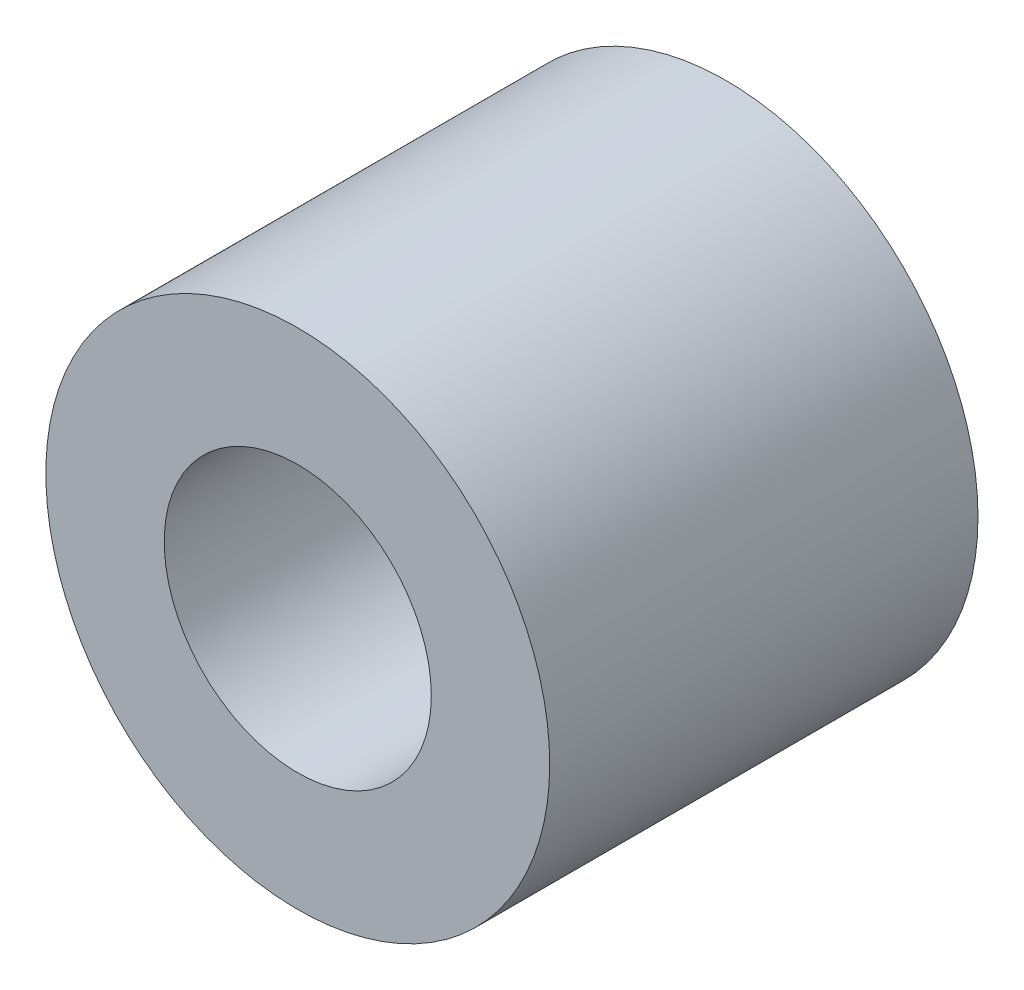
ISO-10303-21;
HEADER;
FILE_DESCRIPTION(('STEP AP214'),'2;1');
FILE_NAME('part.step','',(''),(''),'','','');
FILE_SCHEMA(('AUTOMOTIVE_DESIGN { 1 0 10303 214 1 1 1 1 }'));
ENDSEC;
DATA;
#1=APPLICATION_CONTEXT('core data for automotive mechanical design processes');
#2=APPLICATION_PROTOCOL_DEFINITION('international standard','automotive_design',2000,#1);
#3=PRODUCT_CONTEXT('',#1,'mechanical');
#4=PRODUCT('Part','Part','',(#3));
#5=PRODUCT_RELATED_PRODUCT_CATEGORY('part','',(#4));
#6=PRODUCT_DEFINITION_FORMATION('','',#4);
#7=PRODUCT_DEFINITION_CONTEXT('part definition',#1,'design');
#8=PRODUCT_DEFINITION('design','',#6,#7);
#9=PRODUCT_DEFINITION_SHAPE('','',#8);
#10=(LENGTH_UNIT() NAMED_UNIT(*) SI_UNIT(.MILLI.,.METRE.));
#11=(NAMED_UNIT(*) PLANE_ANGLE_UNIT() SI_UNIT($,.RADIAN.));
#12=(NAMED_UNIT(*) SI_UNIT($,.STERADIAN.) SOLID_ANGLE_UNIT());
#13=UNCERTAINTY_MEASURE_WITH_UNIT(LENGTH_MEASURE(1.E-05),#10,'distance_accuracy_value','');
#14=(GEOMETRIC_REPRESENTATION_CONTEXT(3) GLOBAL_UNCERTAINTY_ASSIGNED_CONTEXT((#13)) GLOBAL_UNIT_ASSIGNED_CONTEXT((#10,
#11,#12)) REPRESENTATION_CONTEXT('',''));
#15=CARTESIAN_POINT('',(0.,0.,0.));
#16=DIRECTION('',(0.,0.,1.));
#17=DIRECTION('',(1.,0.,0.));
#18=AXIS2_PLACEMENT_3D('',#15,#16,#17);
#19=CARTESIAN_POINT('',(0.,0.,8.5));
#20=DIRECTION('',(0.,0.,1.));
#21=DIRECTION('',(1.,0.,0.));
#22=AXIS2_PLACEMENT_3D('',#19,#20,#21);
#23=PLANE('',#22);
#24=CARTESIAN_POINT('',(0.,0.,8.5));
#25=DIRECTION('',(0.,0.,1.));
#26=DIRECTION('',(1.,0.,0.));
#27=AXIS2_PLACEMENT_3D('',#24,#25,#26);
#28=CIRCLE('',#27,5.);
#29=CARTESIAN_POINT('',(5.,0.,8.5));
#30=VERTEX_POINT('',#29);
#31=EDGE_CURVE('E10',#30,#30,#28,.T.);
#32=ORIENTED_EDGE('',*,*,#31,.T.);
#33=EDGE_LOOP('',(#32));
#34=FACE_BOUND('',#33,.T.);
#35=CARTESIAN_POINT('',(0.,0.,8.5));
#36=DIRECTION('',(0.,0.,1.));
#37=DIRECTION('',(1.,0.,0.));
#38=AXIS2_PLACEMENT_3D('',#35,#36,#37);
#39=CIRCLE('',#38,2.65);
#40=CARTESIAN_POINT('',(2.65,0.,8.5));
#41=VERTEX_POINT('',#40);
#42=EDGE_CURVE('E41',#41,#41,#39,.T.);
#43=ORIENTED_EDGE('',*,*,#42,.F.);
#44=EDGE_LOOP('',(#43));
#45=FACE_BOUND('',#44,.T.);
#46=ADVANCED_FACE('F30',(#34,#45),#23,.T.);
#47=CARTESIAN_POINT('',(0.,0.,0.));
#48=DIRECTION('',(0.,0.,1.));
#49=DIRECTION('',(1.,0.,0.));
#50=AXIS2_PLACEMENT_3D('',#47,#48,#49);
#51=PLANE('',#50);
#52=CARTESIAN_POINT('',(0.,0.,0.));
#53=DIRECTION('',(0.,0.,1.));
#54=DIRECTION('',(1.,0.,0.));
#55=AXIS2_PLACEMENT_3D('',#52,#53,#54);
#56=CIRCLE('',#55,5.);
#57=CARTESIAN_POINT('',(5.,0.,0.));
#58=VERTEX_POINT('',#57);
#59=EDGE_CURVE('E34',#58,#58,#56,.T.);
#60=ORIENTED_EDGE('',*,*,#59,.F.);
#61=EDGE_LOOP('',(#60));
#62=FACE_BOUND('',#61,.T.);
#63=CARTESIAN_POINT('',(0.,0.,0.));
#64=DIRECTION('',(0.,0.,1.));
#65=DIRECTION('',(1.,0.,0.));
#66=AXIS2_PLACEMENT_3D('',#63,#64,#65);
#67=CIRCLE('',#66,2.65);
#68=CARTESIAN_POINT('',(2.65,0.,0.));
#69=VERTEX_POINT('',#68);
#70=EDGE_CURVE('E43',#69,#69,#67,.T.);
#71=ORIENTED_EDGE('',*,*,#70,.T.);
#72=EDGE_LOOP('',(#71));
#73=FACE_BOUND('',#72,.T.);
#74=ADVANCED_FACE('F53',(#62,#73),#51,.F.);
#75=CARTESIAN_POINT('',(0.,0.,8.5));
#76=DIRECTION('',(0.,0.,-1.));
#77=DIRECTION('',(-1.,0.,0.));
#78=AXIS2_PLACEMENT_3D('',#75,#76,#77);
#79=CYLINDRICAL_SURFACE('',#78,5.);
#80=ORIENTED_EDGE('',*,*,#31,.F.);
#81=EDGE_LOOP('',(#80));
#82=FACE_BOUND('',#81,.T.);
#83=ORIENTED_EDGE('',*,*,#59,.T.);
#84=EDGE_LOOP('',(#83));
#85=FACE_BOUND('',#84,.T.);
#86=ADVANCED_FACE('F32',(#82,#85),#79,.T.);
#87=CARTESIAN_POINT('',(0.,0.,8.5));
#88=DIRECTION('',(0.,0.,-1.));
#89=DIRECTION('',(-1.,0.,0.));
#90=AXIS2_PLACEMENT_3D('',#87,#88,#89);
#91=CYLINDRICAL_SURFACE('',#90,2.65);
#92=ORIENTED_EDGE('',*,*,#42,.T.);
#93=EDGE_LOOP('',(#92));
#94=FACE_BOUND('',#93,.T.);
#95=ORIENTED_EDGE('',*,*,#70,.F.);
#96=EDGE_LOOP('',(#95));
#97=FACE_BOUND('',#96,.T.);
#98=ADVANCED_FACE('F49',(#94,#97),#91,.F.);
#99=CLOSED_SHELL('',(#46,#74,#86,#98));
#100=MANIFOLD_SOLID_BREP('B2',#99);
#101=ADVANCED_BREP_SHAPE_REPRESENTATION('',(#18,#100),#14);
#102=SHAPE_DEFINITION_REPRESENTATION(#9,#101);
ENDSEC;
END-ISO-10303-21;
